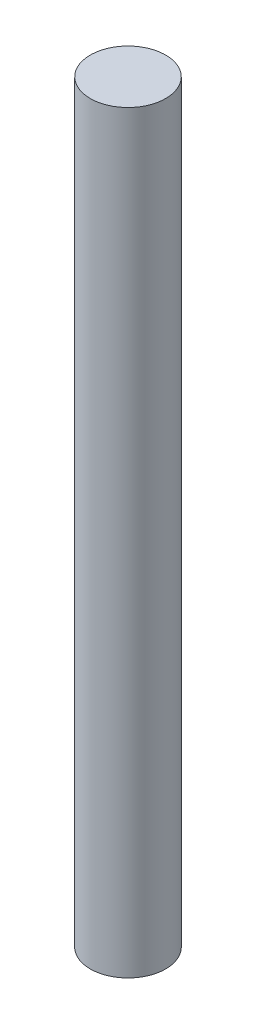
ISO-10303-21;
HEADER;
FILE_DESCRIPTION(('STEP AP214'),'2;1');
FILE_NAME('part.step','',(''),(''),'','','');
FILE_SCHEMA(('AUTOMOTIVE_DESIGN { 1 0 10303 214 1 1 1 1 }'));
ENDSEC;
DATA;
#1=APPLICATION_CONTEXT('core data for automotive mechanical design processes');
#2=APPLICATION_PROTOCOL_DEFINITION('international standard','automotive_design',2000,#1);
#3=PRODUCT_CONTEXT('',#1,'mechanical');
#4=PRODUCT('Part','Part','',(#3));
#5=PRODUCT_RELATED_PRODUCT_CATEGORY('part','',(#4));
#6=PRODUCT_DEFINITION_FORMATION('','',#4);
#7=PRODUCT_DEFINITION_CONTEXT('part definition',#1,'design');
#8=PRODUCT_DEFINITION('design','',#6,#7);
#9=PRODUCT_DEFINITION_SHAPE('','',#8);
#10=(LENGTH_UNIT() NAMED_UNIT(*) SI_UNIT(.MILLI.,.METRE.));
#11=(NAMED_UNIT(*) PLANE_ANGLE_UNIT() SI_UNIT($,.RADIAN.));
#12=(NAMED_UNIT(*) SI_UNIT($,.STERADIAN.) SOLID_ANGLE_UNIT());
#13=UNCERTAINTY_MEASURE_WITH_UNIT(LENGTH_MEASURE(1.E-05),#10,'distance_accuracy_value','');
#14=(GEOMETRIC_REPRESENTATION_CONTEXT(3) GLOBAL_UNCERTAINTY_ASSIGNED_CONTEXT((#13)) GLOBAL_UNIT_ASSIGNED_CONTEXT((#10,
#11,#12)) REPRESENTATION_CONTEXT('',''));
#15=CARTESIAN_POINT('',(0.,0.,0.));
#16=DIRECTION('',(0.,0.,1.));
#17=DIRECTION('',(1.,0.,0.));
#18=AXIS2_PLACEMENT_3D('',#15,#16,#17);
#19=CARTESIAN_POINT('',(0.,150.,0.));
#20=DIRECTION('',(0.,-1.,0.));
#21=DIRECTION('',(0.,0.,-1.));
#22=AXIS2_PLACEMENT_3D('',#19,#20,#21);
#23=CYLINDRICAL_SURFACE('',#22,7.5);
#24=CARTESIAN_POINT('',(0.,150.,0.));
#25=DIRECTION('',(0.,1.,0.));
#26=DIRECTION('',(0.,0.,1.));
#27=AXIS2_PLACEMENT_3D('',#24,#25,#26);
#28=CIRCLE('',#27,7.5);
#29=CARTESIAN_POINT('',(0.,150.,7.5));
#30=VERTEX_POINT('',#29);
#31=EDGE_CURVE('E10',#30,#30,#28,.T.);
#32=ORIENTED_EDGE('',*,*,#31,.F.);
#33=EDGE_LOOP('',(#32));
#34=FACE_BOUND('',#33,.T.);
#35=CARTESIAN_POINT('',(0.,0.,0.));
#36=DIRECTION('',(0.,1.,0.));
#37=DIRECTION('',(0.,0.,1.));
#38=AXIS2_PLACEMENT_3D('',#35,#36,#37);
#39=CIRCLE('',#38,7.5);
#40=CARTESIAN_POINT('',(0.,0.,7.5));
#41=VERTEX_POINT('',#40);
#42=EDGE_CURVE('E36',#41,#41,#39,.T.);
#43=ORIENTED_EDGE('',*,*,#42,.T.);
#44=EDGE_LOOP('',(#43));
#45=FACE_BOUND('',#44,.T.);
#46=ADVANCED_FACE('F33',(#34,#45),#23,.T.);
#47=CARTESIAN_POINT('',(0.,150.,0.));
#48=DIRECTION('',(0.,1.,0.));
#49=DIRECTION('',(0.,0.,1.));
#50=AXIS2_PLACEMENT_3D('',#47,#48,#49);
#51=PLANE('',#50);
#52=ORIENTED_EDGE('',*,*,#31,.T.);
#53=EDGE_LOOP('',(#52));
#54=FACE_BOUND('',#53,.T.);
#55=ADVANCED_FACE('F48',(#54),#51,.T.);
#56=CARTESIAN_POINT('',(0.,0.,0.));
#57=DIRECTION('',(0.,1.,0.));
#58=DIRECTION('',(0.,0.,1.));
#59=AXIS2_PLACEMENT_3D('',#56,#57,#58);
#60=PLANE('',#59);
#61=ORIENTED_EDGE('',*,*,#42,.F.);
#62=EDGE_LOOP('',(#61));
#63=FACE_BOUND('',#62,.T.);
#64=ADVANCED_FACE('F46',(#63),#60,.F.);
#65=CLOSED_SHELL('',(#46,#55,#64));
#66=MANIFOLD_SOLID_BREP('B2',#65);
#67=ADVANCED_BREP_SHAPE_REPRESENTATION('',(#18,#66),#14);
#68=SHAPE_DEFINITION_REPRESENTATION(#9,#67);
ENDSEC;
END-ISO-10303-21;
